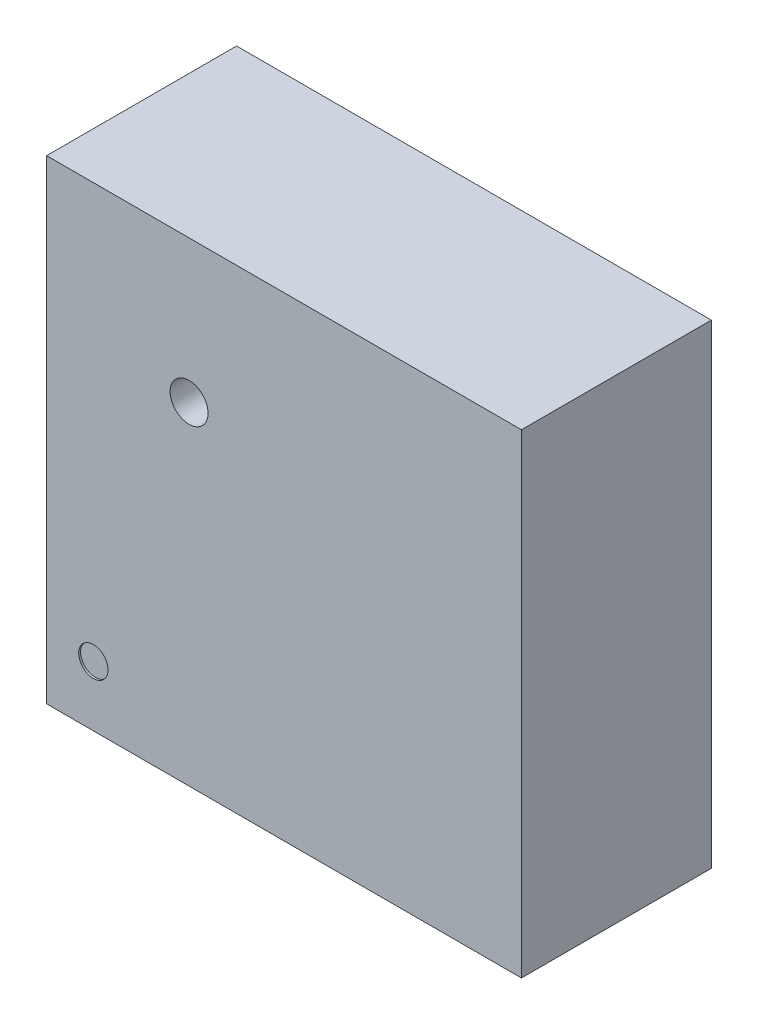
ISO-10303-21;
HEADER;
FILE_DESCRIPTION(('STEP AP214'),'2;1');
FILE_NAME('part.step','',(''),(''),'','','');
FILE_SCHEMA(('AUTOMOTIVE_DESIGN { 1 0 10303 214 1 1 1 1 }'));
ENDSEC;
DATA;
#1=APPLICATION_CONTEXT('core data for automotive mechanical design processes');
#2=APPLICATION_PROTOCOL_DEFINITION('international standard','automotive_design',2000,#1);
#3=PRODUCT_CONTEXT('',#1,'mechanical');
#4=PRODUCT('Part','Part','',(#3));
#5=PRODUCT_RELATED_PRODUCT_CATEGORY('part','',(#4));
#6=PRODUCT_DEFINITION_FORMATION('','',#4);
#7=PRODUCT_DEFINITION_CONTEXT('part definition',#1,'design');
#8=PRODUCT_DEFINITION('design','',#6,#7);
#9=PRODUCT_DEFINITION_SHAPE('','',#8);
#10=(LENGTH_UNIT() NAMED_UNIT(*) SI_UNIT(.MILLI.,.METRE.));
#11=(NAMED_UNIT(*) PLANE_ANGLE_UNIT() SI_UNIT($,.RADIAN.));
#12=(NAMED_UNIT(*) SI_UNIT($,.STERADIAN.) SOLID_ANGLE_UNIT());
#13=UNCERTAINTY_MEASURE_WITH_UNIT(LENGTH_MEASURE(1.E-05),#10,'distance_accuracy_value','');
#14=(GEOMETRIC_REPRESENTATION_CONTEXT(3) GLOBAL_UNCERTAINTY_ASSIGNED_CONTEXT((#13)) GLOBAL_UNIT_ASSIGNED_CONTEXT((#10,
#11,#12)) REPRESENTATION_CONTEXT('',''));
#15=CARTESIAN_POINT('',(0.,0.,0.));
#16=DIRECTION('',(0.,0.,1.));
#17=DIRECTION('',(1.,0.,0.));
#18=AXIS2_PLACEMENT_3D('',#15,#16,#17);
#19=CARTESIAN_POINT('',(1.25000000000001,-1.25,1.));
#20=DIRECTION('',(-1.,0.,0.));
#21=DIRECTION('',(0.,0.,1.));
#22=AXIS2_PLACEMENT_3D('',#19,#20,#21);
#23=PLANE('',#22);
#24=DIRECTION('',(0.,1.,0.));
#25=VECTOR('',#24,1.);
#26=CARTESIAN_POINT('',(1.25000000000001,-1.25,0.));
#27=LINE('',#26,#25);
#28=CARTESIAN_POINT('',(1.25000000000001,-1.25,0.));
#29=VERTEX_POINT('',#28);
#30=CARTESIAN_POINT('',(1.25000000000001,1.25,0.));
#31=VERTEX_POINT('',#30);
#32=EDGE_CURVE('E96',#29,#31,#27,.T.);
#33=ORIENTED_EDGE('',*,*,#32,.T.);
#34=DIRECTION('',(0.,0.,-1.));
#35=VECTOR('',#34,1.);
#36=CARTESIAN_POINT('',(1.25000000000001,1.25,1.));
#37=LINE('',#36,#35);
#38=CARTESIAN_POINT('',(1.25000000000001,1.25,1.));
#39=VERTEX_POINT('',#38);
#40=EDGE_CURVE('E11',#39,#31,#37,.T.);
#41=ORIENTED_EDGE('',*,*,#40,.F.);
#42=DIRECTION('',(0.,1.,0.));
#43=VECTOR('',#42,1.);
#44=CARTESIAN_POINT('',(1.25000000000001,-1.25,1.));
#45=LINE('',#44,#43);
#46=CARTESIAN_POINT('',(1.25000000000001,-1.25,1.));
#47=VERTEX_POINT('',#46);
#48=EDGE_CURVE('E84',#47,#39,#45,.T.);
#49=ORIENTED_EDGE('',*,*,#48,.F.);
#50=DIRECTION('',(0.,0.,-1.));
#51=VECTOR('',#50,1.);
#52=CARTESIAN_POINT('',(1.25000000000001,-1.25,1.));
#53=LINE('',#52,#51);
#54=EDGE_CURVE('E92',#47,#29,#53,.T.);
#55=ORIENTED_EDGE('',*,*,#54,.T.);
#56=EDGE_LOOP('',(#33,#41,#49,#55));
#57=FACE_BOUND('',#56,.T.);
#58=ADVANCED_FACE('F33',(#57),#23,.F.);
#59=CARTESIAN_POINT('',(-1.24999999999999,1.25,1.));
#60=DIRECTION('',(0.,-1.,0.));
#61=DIRECTION('',(0.,0.,-1.));
#62=AXIS2_PLACEMENT_3D('',#59,#60,#61);
#63=PLANE('',#62);
#64=DIRECTION('',(-1.,0.,0.));
#65=VECTOR('',#64,1.);
#66=CARTESIAN_POINT('',(-1.24999999999999,1.25,0.));
#67=LINE('',#66,#65);
#68=CARTESIAN_POINT('',(-1.24999999999999,1.25,0.));
#69=VERTEX_POINT('',#68);
#70=EDGE_CURVE('E88',#31,#69,#67,.T.);
#71=ORIENTED_EDGE('',*,*,#70,.T.);
#72=DIRECTION('',(0.,0.,-1.));
#73=VECTOR('',#72,1.);
#74=CARTESIAN_POINT('',(-1.24999999999999,1.25,1.));
#75=LINE('',#74,#73);
#76=CARTESIAN_POINT('',(-1.24999999999999,1.25,1.));
#77=VERTEX_POINT('',#76);
#78=EDGE_CURVE('E41',#77,#69,#75,.T.);
#79=ORIENTED_EDGE('',*,*,#78,.F.);
#80=DIRECTION('',(-1.,0.,0.));
#81=VECTOR('',#80,1.);
#82=CARTESIAN_POINT('',(-1.24999999999999,1.25,1.));
#83=LINE('',#82,#81);
#84=EDGE_CURVE('E79',#39,#77,#83,.T.);
#85=ORIENTED_EDGE('',*,*,#84,.F.);
#86=ORIENTED_EDGE('',*,*,#40,.T.);
#87=EDGE_LOOP('',(#71,#79,#85,#86));
#88=FACE_BOUND('',#87,.T.);
#89=ADVANCED_FACE('F87',(#88),#63,.F.);
#90=CARTESIAN_POINT('',(-1.24999999999999,-1.25,1.));
#91=DIRECTION('',(1.,0.,0.));
#92=DIRECTION('',(0.,0.,-1.));
#93=AXIS2_PLACEMENT_3D('',#90,#91,#92);
#94=PLANE('',#93);
#95=DIRECTION('',(0.,-1.,0.));
#96=VECTOR('',#95,1.);
#97=CARTESIAN_POINT('',(-1.24999999999999,-1.25,0.));
#98=LINE('',#97,#96);
#99=CARTESIAN_POINT('',(-1.24999999999999,-1.25,0.));
#100=VERTEX_POINT('',#99);
#101=EDGE_CURVE('E66',#69,#100,#98,.T.);
#102=ORIENTED_EDGE('',*,*,#101,.T.);
#103=DIRECTION('',(0.,0.,-1.));
#104=VECTOR('',#103,1.);
#105=CARTESIAN_POINT('',(-1.24999999999999,-1.25,1.));
#106=LINE('',#105,#104);
#107=CARTESIAN_POINT('',(-1.24999999999999,-1.25,1.));
#108=VERTEX_POINT('',#107);
#109=EDGE_CURVE('E89',#108,#100,#106,.T.);
#110=ORIENTED_EDGE('',*,*,#109,.F.);
#111=DIRECTION('',(0.,-1.,0.));
#112=VECTOR('',#111,1.);
#113=CARTESIAN_POINT('',(-1.24999999999999,-1.25,1.));
#114=LINE('',#113,#112);
#115=EDGE_CURVE('E82',#77,#108,#114,.T.);
#116=ORIENTED_EDGE('',*,*,#115,.F.);
#117=ORIENTED_EDGE('',*,*,#78,.T.);
#118=EDGE_LOOP('',(#102,#110,#116,#117));
#119=FACE_BOUND('',#118,.T.);
#120=ADVANCED_FACE('F90',(#119),#94,.F.);
#121=CARTESIAN_POINT('',(-1.24999999999999,-1.25,1.));
#122=DIRECTION('',(0.,1.,0.));
#123=DIRECTION('',(0.,0.,1.));
#124=AXIS2_PLACEMENT_3D('',#121,#122,#123);
#125=PLANE('',#124);
#126=DIRECTION('',(1.,0.,0.));
#127=VECTOR('',#126,1.);
#128=CARTESIAN_POINT('',(-1.24999999999999,-1.25,0.));
#129=LINE('',#128,#127);
#130=EDGE_CURVE('E72',#100,#29,#129,.T.);
#131=ORIENTED_EDGE('',*,*,#130,.T.);
#132=ORIENTED_EDGE('',*,*,#54,.F.);
#133=DIRECTION('',(1.,0.,0.));
#134=VECTOR('',#133,1.);
#135=CARTESIAN_POINT('',(-1.24999999999999,-1.25,1.));
#136=LINE('',#135,#134);
#137=EDGE_CURVE('E49',#108,#47,#136,.T.);
#138=ORIENTED_EDGE('',*,*,#137,.F.);
#139=ORIENTED_EDGE('',*,*,#109,.T.);
#140=EDGE_LOOP('',(#131,#132,#138,#139));
#141=FACE_BOUND('',#140,.T.);
#142=ADVANCED_FACE('F104',(#141),#125,.F.);
#143=CARTESIAN_POINT('',(0.,0.,1.));
#144=DIRECTION('',(0.,0.,-1.));
#145=DIRECTION('',(-1.,0.,0.));
#146=AXIS2_PLACEMENT_3D('',#143,#144,#145);
#147=PLANE('',#146);
#148=CARTESIAN_POINT('',(-1.00403885625644,-0.933808159057151,1.));
#149=DIRECTION('',(0.,0.,1.));
#150=DIRECTION('',(1.,0.,0.));
#151=AXIS2_PLACEMENT_3D('',#148,#149,#150);
#152=CIRCLE('',#151,0.0773373609434575);
#153=CARTESIAN_POINT('',(-0.926701495312979,-0.933808159057151,1.));
#154=VERTEX_POINT('',#153);
#155=EDGE_CURVE('E116',#154,#154,#152,.T.);
#156=ORIENTED_EDGE('',*,*,#155,.F.);
#157=EDGE_LOOP('',(#156));
#158=FACE_BOUND('',#157,.T.);
#159=CARTESIAN_POINT('',(-0.5,0.5,1.));
#160=DIRECTION('',(0.,0.,1.));
#161=DIRECTION('',(1.,0.,0.));
#162=AXIS2_PLACEMENT_3D('',#159,#160,#161);
#163=CIRCLE('',#162,0.1);
#164=CARTESIAN_POINT('',(-0.4,0.5,1.));
#165=VERTEX_POINT('',#164);
#166=EDGE_CURVE('E110',#165,#165,#163,.T.);
#167=ORIENTED_EDGE('',*,*,#166,.F.);
#168=EDGE_LOOP('',(#167));
#169=FACE_BOUND('',#168,.T.);
#170=ORIENTED_EDGE('',*,*,#48,.T.);
#171=ORIENTED_EDGE('',*,*,#84,.T.);
#172=ORIENTED_EDGE('',*,*,#115,.T.);
#173=ORIENTED_EDGE('',*,*,#137,.T.);
#174=EDGE_LOOP('',(#170,#171,#172,#173));
#175=FACE_BOUND('',#174,.T.);
#176=ADVANCED_FACE('F80',(#158,#169,#175),#147,.F.);
#177=CARTESIAN_POINT('',(0.,0.,0.));
#178=DIRECTION('',(0.,0.,-1.));
#179=DIRECTION('',(-1.,0.,0.));
#180=AXIS2_PLACEMENT_3D('',#177,#178,#179);
#181=PLANE('',#180);
#182=ORIENTED_EDGE('',*,*,#32,.F.);
#183=ORIENTED_EDGE('',*,*,#130,.F.);
#184=ORIENTED_EDGE('',*,*,#101,.F.);
#185=ORIENTED_EDGE('',*,*,#70,.F.);
#186=EDGE_LOOP('',(#182,#183,#184,#185));
#187=FACE_BOUND('',#186,.T.);
#188=ADVANCED_FACE('F107',(#187),#181,.T.);
#189=CARTESIAN_POINT('',(-0.5,0.5,0.8));
#190=DIRECTION('',(0.,0.,1.));
#191=DIRECTION('',(1.,0.,0.));
#192=AXIS2_PLACEMENT_3D('',#189,#190,#191);
#193=CYLINDRICAL_SURFACE('',#192,0.1);
#194=CARTESIAN_POINT('',(-0.5,0.5,0.8));
#195=DIRECTION('',(0.,0.,1.));
#196=DIRECTION('',(1.,0.,0.));
#197=AXIS2_PLACEMENT_3D('',#194,#195,#196);
#198=CIRCLE('',#197,0.1);
#199=CARTESIAN_POINT('',(-0.4,0.5,0.8));
#200=VERTEX_POINT('',#199);
#201=EDGE_CURVE('E99',#200,#200,#198,.T.);
#202=ORIENTED_EDGE('',*,*,#201,.F.);
#203=EDGE_LOOP('',(#202));
#204=FACE_BOUND('',#203,.T.);
#205=ORIENTED_EDGE('',*,*,#166,.T.);
#206=EDGE_LOOP('',(#205));
#207=FACE_BOUND('',#206,.T.);
#208=ADVANCED_FACE('F136',(#204,#207),#193,.F.);
#209=CARTESIAN_POINT('',(-0.5,0.5,0.8));
#210=DIRECTION('',(0.,0.,1.));
#211=DIRECTION('',(1.,0.,0.));
#212=AXIS2_PLACEMENT_3D('',#209,#210,#211);
#213=PLANE('',#212);
#214=ORIENTED_EDGE('',*,*,#201,.T.);
#215=EDGE_LOOP('',(#214));
#216=FACE_BOUND('',#215,.T.);
#217=ADVANCED_FACE('F127',(#216),#213,.T.);
#218=CARTESIAN_POINT('',(-1.00403885625644,-0.933808159057151,0.99));
#219=DIRECTION('',(0.,0.,1.));
#220=DIRECTION('',(1.,0.,0.));
#221=AXIS2_PLACEMENT_3D('',#218,#219,#220);
#222=CYLINDRICAL_SURFACE('',#221,0.0773373609434575);
#223=CARTESIAN_POINT('',(-1.00403885625644,-0.933808159057151,0.99));
#224=DIRECTION('',(0.,0.,1.));
#225=DIRECTION('',(1.,0.,0.));
#226=AXIS2_PLACEMENT_3D('',#223,#224,#225);
#227=CIRCLE('',#226,0.0773373609434575);
#228=CARTESIAN_POINT('',(-0.926701495312979,-0.933808159057151,0.99));
#229=VERTEX_POINT('',#228);
#230=EDGE_CURVE('E113',#229,#229,#227,.T.);
#231=ORIENTED_EDGE('',*,*,#230,.F.);
#232=EDGE_LOOP('',(#231));
#233=FACE_BOUND('',#232,.T.);
#234=ORIENTED_EDGE('',*,*,#155,.T.);
#235=EDGE_LOOP('',(#234));
#236=FACE_BOUND('',#235,.T.);
#237=ADVANCED_FACE('F124',(#233,#236),#222,.F.);
#238=CARTESIAN_POINT('',(-1.00403885625644,-0.933808159057151,0.99));
#239=DIRECTION('',(0.,0.,1.));
#240=DIRECTION('',(1.,0.,0.));
#241=AXIS2_PLACEMENT_3D('',#238,#239,#240);
#242=PLANE('',#241);
#243=ORIENTED_EDGE('',*,*,#230,.T.);
#244=EDGE_LOOP('',(#243));
#245=FACE_BOUND('',#244,.T.);
#246=ADVANCED_FACE('F122',(#245),#242,.T.);
#247=CLOSED_SHELL('',(#58,#89,#120,#142,#176,#188,#208,#217,#237,#246));
#248=MANIFOLD_SOLID_BREP('B2',#247);
#249=ADVANCED_BREP_SHAPE_REPRESENTATION('',(#18,#248),#14);
#250=SHAPE_DEFINITION_REPRESENTATION(#9,#249);
ENDSEC;
END-ISO-10303-21;
